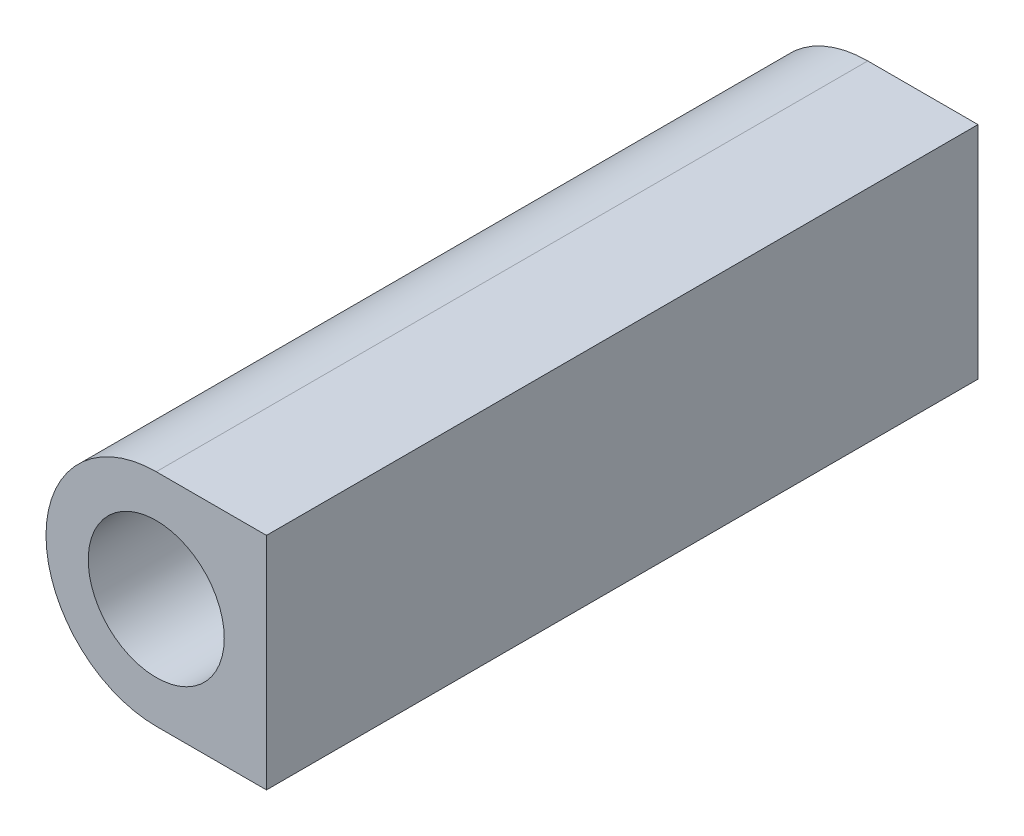
ISO-10303-21;
HEADER;
FILE_DESCRIPTION(('STEP AP214'),'2;1');
FILE_NAME('part.step','',(''),(''),'','','');
FILE_SCHEMA(('AUTOMOTIVE_DESIGN { 1 0 10303 214 1 1 1 1 }'));
ENDSEC;
DATA;
#1=APPLICATION_CONTEXT('core data for automotive mechanical design processes');
#2=APPLICATION_PROTOCOL_DEFINITION('international standard','automotive_design',2000,#1);
#3=PRODUCT_CONTEXT('',#1,'mechanical');
#4=PRODUCT('Part','Part','',(#3));
#5=PRODUCT_RELATED_PRODUCT_CATEGORY('part','',(#4));
#6=PRODUCT_DEFINITION_FORMATION('','',#4);
#7=PRODUCT_DEFINITION_CONTEXT('part definition',#1,'design');
#8=PRODUCT_DEFINITION('design','',#6,#7);
#9=PRODUCT_DEFINITION_SHAPE('','',#8);
#10=(LENGTH_UNIT() NAMED_UNIT(*) SI_UNIT(.MILLI.,.METRE.));
#11=(NAMED_UNIT(*) PLANE_ANGLE_UNIT() SI_UNIT($,.RADIAN.));
#12=(NAMED_UNIT(*) SI_UNIT($,.STERADIAN.) SOLID_ANGLE_UNIT());
#13=UNCERTAINTY_MEASURE_WITH_UNIT(LENGTH_MEASURE(1.E-05),#10,'distance_accuracy_value','');
#14=(GEOMETRIC_REPRESENTATION_CONTEXT(3) GLOBAL_UNCERTAINTY_ASSIGNED_CONTEXT((#13)) GLOBAL_UNIT_ASSIGNED_CONTEXT((#10,
#11,#12)) REPRESENTATION_CONTEXT('',''));
#15=CARTESIAN_POINT('',(0.,0.,0.));
#16=DIRECTION('',(0.,0.,1.));
#17=DIRECTION('',(1.,0.,0.));
#18=AXIS2_PLACEMENT_3D('',#15,#16,#17);
#19=CARTESIAN_POINT('',(12.5,12.5,80.6823752757681));
#20=DIRECTION('',(0.,-1.,0.));
#21=DIRECTION('',(0.,0.,-1.));
#22=AXIS2_PLACEMENT_3D('',#19,#20,#21);
#23=PLANE('',#22);
#24=DIRECTION('',(-1.,0.,0.));
#25=VECTOR('',#24,1.);
#26=CARTESIAN_POINT('',(12.5,12.5,0.));
#27=LINE('',#26,#25);
#28=CARTESIAN_POINT('',(12.5,12.5,0.));
#29=VERTEX_POINT('',#28);
#30=CARTESIAN_POINT('',(0.,12.5,0.));
#31=VERTEX_POINT('',#30);
#32=EDGE_CURVE('E115',#29,#31,#27,.T.);
#33=ORIENTED_EDGE('',*,*,#32,.T.);
#34=DIRECTION('',(0.,0.,-1.));
#35=VECTOR('',#34,1.);
#36=CARTESIAN_POINT('',(0.,12.5,80.6823752757681));
#37=LINE('',#36,#35);
#38=CARTESIAN_POINT('',(0.,12.5,80.6823752757681));
#39=VERTEX_POINT('',#38);
#40=EDGE_CURVE('E11',#39,#31,#37,.T.);
#41=ORIENTED_EDGE('',*,*,#40,.F.);
#42=DIRECTION('',(-1.,0.,0.));
#43=VECTOR('',#42,1.);
#44=CARTESIAN_POINT('',(12.5,12.5,80.6823752757681));
#45=LINE('',#44,#43);
#46=CARTESIAN_POINT('',(12.5,12.5,80.6823752757681));
#47=VERTEX_POINT('',#46);
#48=EDGE_CURVE('E98',#47,#39,#45,.T.);
#49=ORIENTED_EDGE('',*,*,#48,.F.);
#50=DIRECTION('',(0.,0.,-1.));
#51=VECTOR('',#50,1.);
#52=CARTESIAN_POINT('',(12.5,12.5,80.6823752757681));
#53=LINE('',#52,#51);
#54=EDGE_CURVE('E111',#47,#29,#53,.T.);
#55=ORIENTED_EDGE('',*,*,#54,.T.);
#56=EDGE_LOOP('',(#33,#41,#49,#55));
#57=FACE_BOUND('',#56,.T.);
#58=ADVANCED_FACE('F45',(#57),#23,.F.);
#59=CARTESIAN_POINT('',(0.,0.,80.6823752757681));
#60=DIRECTION('',(0.,0.,-1.));
#61=DIRECTION('',(-1.,0.,0.));
#62=AXIS2_PLACEMENT_3D('',#59,#60,#61);
#63=CYLINDRICAL_SURFACE('',#62,12.5);
#64=CARTESIAN_POINT('',(0.,0.,0.));
#65=DIRECTION('',(0.,0.,1.));
#66=DIRECTION('',(1.,0.,0.));
#67=AXIS2_PLACEMENT_3D('',#64,#65,#66);
#68=CIRCLE('',#67,12.5);
#69=CARTESIAN_POINT('',(0.,-12.5,0.));
#70=VERTEX_POINT('',#69);
#71=EDGE_CURVE('E103',#31,#70,#68,.T.);
#72=ORIENTED_EDGE('',*,*,#71,.T.);
#73=DIRECTION('',(0.,0.,-1.));
#74=VECTOR('',#73,1.);
#75=CARTESIAN_POINT('',(0.,-12.5,80.6823752757681));
#76=LINE('',#75,#74);
#77=CARTESIAN_POINT('',(0.,-12.5,80.6823752757681));
#78=VERTEX_POINT('',#77);
#79=EDGE_CURVE('E55',#78,#70,#76,.T.);
#80=ORIENTED_EDGE('',*,*,#79,.F.);
#81=CARTESIAN_POINT('',(0.,0.,80.6823752757681));
#82=DIRECTION('',(0.,0.,1.));
#83=DIRECTION('',(1.,0.,0.));
#84=AXIS2_PLACEMENT_3D('',#81,#82,#83);
#85=CIRCLE('',#84,12.5);
#86=EDGE_CURVE('E93',#39,#78,#85,.T.);
#87=ORIENTED_EDGE('',*,*,#86,.F.);
#88=ORIENTED_EDGE('',*,*,#40,.T.);
#89=EDGE_LOOP('',(#72,#80,#87,#88));
#90=FACE_BOUND('',#89,.T.);
#91=ADVANCED_FACE('F102',(#90),#63,.T.);
#92=CARTESIAN_POINT('',(0.,-12.5,80.6823752757681));
#93=DIRECTION('',(0.,1.,0.));
#94=DIRECTION('',(0.,0.,1.));
#95=AXIS2_PLACEMENT_3D('',#92,#93,#94);
#96=PLANE('',#95);
#97=DIRECTION('',(1.,0.,0.));
#98=VECTOR('',#97,1.);
#99=CARTESIAN_POINT('',(0.,-12.5,0.));
#100=LINE('',#99,#98);
#101=CARTESIAN_POINT('',(12.5,-12.5,0.));
#102=VERTEX_POINT('',#101);
#103=EDGE_CURVE('E80',#70,#102,#100,.T.);
#104=ORIENTED_EDGE('',*,*,#103,.T.);
#105=DIRECTION('',(0.,0.,-1.));
#106=VECTOR('',#105,1.);
#107=CARTESIAN_POINT('',(12.5,-12.5,80.6823752757681));
#108=LINE('',#107,#106);
#109=CARTESIAN_POINT('',(12.5,-12.5,80.6823752757681));
#110=VERTEX_POINT('',#109);
#111=EDGE_CURVE('E105',#110,#102,#108,.T.);
#112=ORIENTED_EDGE('',*,*,#111,.F.);
#113=DIRECTION('',(1.,0.,0.));
#114=VECTOR('',#113,1.);
#115=CARTESIAN_POINT('',(0.,-12.5,80.6823752757681));
#116=LINE('',#115,#114);
#117=EDGE_CURVE('E96',#78,#110,#116,.T.);
#118=ORIENTED_EDGE('',*,*,#117,.F.);
#119=ORIENTED_EDGE('',*,*,#79,.T.);
#120=EDGE_LOOP('',(#104,#112,#118,#119));
#121=FACE_BOUND('',#120,.T.);
#122=ADVANCED_FACE('F107',(#121),#96,.F.);
#123=CARTESIAN_POINT('',(12.5,-12.5,80.6823752757681));
#124=DIRECTION('',(-1.,0.,0.));
#125=DIRECTION('',(0.,0.,1.));
#126=AXIS2_PLACEMENT_3D('',#123,#124,#125);
#127=PLANE('',#126);
#128=DIRECTION('',(0.,1.,0.));
#129=VECTOR('',#128,1.);
#130=CARTESIAN_POINT('',(12.5,-12.5,0.));
#131=LINE('',#130,#129);
#132=EDGE_CURVE('E86',#102,#29,#131,.T.);
#133=ORIENTED_EDGE('',*,*,#132,.T.);
#134=ORIENTED_EDGE('',*,*,#54,.F.);
#135=DIRECTION('',(0.,1.,0.));
#136=VECTOR('',#135,1.);
#137=CARTESIAN_POINT('',(12.5,-12.5,80.6823752757681));
#138=LINE('',#137,#136);
#139=EDGE_CURVE('E63',#110,#47,#138,.T.);
#140=ORIENTED_EDGE('',*,*,#139,.F.);
#141=ORIENTED_EDGE('',*,*,#111,.T.);
#142=EDGE_LOOP('',(#133,#134,#140,#141));
#143=FACE_BOUND('',#142,.T.);
#144=ADVANCED_FACE('F129',(#143),#127,.F.);
#145=CARTESIAN_POINT('',(0.,0.,80.6823752757681));
#146=DIRECTION('',(0.,0.,1.));
#147=DIRECTION('',(1.,0.,0.));
#148=AXIS2_PLACEMENT_3D('',#145,#146,#147);
#149=PLANE('',#148);
#150=CARTESIAN_POINT('',(0.,0.,80.6823752757681));
#151=DIRECTION('',(0.,0.,1.));
#152=DIRECTION('',(1.,0.,0.));
#153=AXIS2_PLACEMENT_3D('',#150,#151,#152);
#154=CIRCLE('',#153,7.71309705810667);
#155=CARTESIAN_POINT('',(7.71309705810667,0.,80.6823752757681));
#156=VERTEX_POINT('',#155);
#157=EDGE_CURVE('E119',#156,#156,#154,.T.);
#158=ORIENTED_EDGE('',*,*,#157,.F.);
#159=EDGE_LOOP('',(#158));
#160=FACE_BOUND('',#159,.T.);
#161=ORIENTED_EDGE('',*,*,#48,.T.);
#162=ORIENTED_EDGE('',*,*,#86,.T.);
#163=ORIENTED_EDGE('',*,*,#117,.T.);
#164=ORIENTED_EDGE('',*,*,#139,.T.);
#165=EDGE_LOOP('',(#161,#162,#163,#164));
#166=FACE_BOUND('',#165,.T.);
#167=ADVANCED_FACE('F94',(#160,#166),#149,.T.);
#168=CARTESIAN_POINT('',(0.,0.,0.));
#169=DIRECTION('',(0.,0.,1.));
#170=DIRECTION('',(1.,0.,0.));
#171=AXIS2_PLACEMENT_3D('',#168,#169,#170);
#172=PLANE('',#171);
#173=CARTESIAN_POINT('',(0.,0.,0.));
#174=DIRECTION('',(0.,0.,-1.));
#175=DIRECTION('',(-1.,0.,0.));
#176=AXIS2_PLACEMENT_3D('',#173,#174,#175);
#177=CIRCLE('',#176,3.5);
#178=CARTESIAN_POINT('',(-3.5,0.,0.));
#179=VERTEX_POINT('',#178);
#180=EDGE_CURVE('E139',#179,#179,#177,.T.);
#181=ORIENTED_EDGE('',*,*,#180,.F.);
#182=EDGE_LOOP('',(#181));
#183=FACE_BOUND('',#182,.T.);
#184=ORIENTED_EDGE('',*,*,#32,.F.);
#185=ORIENTED_EDGE('',*,*,#132,.F.);
#186=ORIENTED_EDGE('',*,*,#103,.F.);
#187=ORIENTED_EDGE('',*,*,#71,.F.);
#188=EDGE_LOOP('',(#184,#185,#186,#187));
#189=FACE_BOUND('',#188,.T.);
#190=ADVANCED_FACE('F132',(#183,#189),#172,.F.);
#191=CARTESIAN_POINT('',(0.,0.,55.6823752757681));
#192=DIRECTION('',(0.,0.,1.));
#193=DIRECTION('',(1.,0.,0.));
#194=AXIS2_PLACEMENT_3D('',#191,#192,#193);
#195=CYLINDRICAL_SURFACE('',#194,7.71309705810667);
#196=ORIENTED_EDGE('',*,*,#157,.T.);
#197=EDGE_LOOP('',(#196));
#198=FACE_BOUND('',#197,.T.);
#199=CARTESIAN_POINT('',(0.,0.,5.68237527576813));
#200=DIRECTION('',(0.,0.,1.));
#201=DIRECTION('',(1.,0.,0.));
#202=AXIS2_PLACEMENT_3D('',#199,#200,#201);
#203=CIRCLE('',#202,7.71309705810667);
#204=CARTESIAN_POINT('',(7.71309705810667,0.,5.68237527576813));
#205=VERTEX_POINT('',#204);
#206=EDGE_CURVE('E143',#205,#205,#203,.T.);
#207=ORIENTED_EDGE('',*,*,#206,.F.);
#208=EDGE_LOOP('',(#207));
#209=FACE_BOUND('',#208,.T.);
#210=ADVANCED_FACE('F160',(#198,#209),#195,.F.);
#211=CARTESIAN_POINT('',(0.,0.,5.));
#212=DIRECTION('',(0.,0.,-1.));
#213=DIRECTION('',(-1.,0.,0.));
#214=AXIS2_PLACEMENT_3D('',#211,#212,#213);
#215=CYLINDRICAL_SURFACE('',#214,3.5);
#216=ORIENTED_EDGE('',*,*,#180,.T.);
#217=EDGE_LOOP('',(#216));
#218=FACE_BOUND('',#217,.T.);
#219=CARTESIAN_POINT('',(0.,0.,5.68237527576813));
#220=DIRECTION('',(0.,0.,1.));
#221=DIRECTION('',(1.,0.,0.));
#222=AXIS2_PLACEMENT_3D('',#219,#220,#221);
#223=CIRCLE('',#222,3.5);
#224=CARTESIAN_POINT('',(3.5,0.,5.68237527576813));
#225=VERTEX_POINT('',#224);
#226=EDGE_CURVE('E48',#225,#225,#223,.T.);
#227=ORIENTED_EDGE('',*,*,#226,.T.);
#228=EDGE_LOOP('',(#227));
#229=FACE_BOUND('',#228,.T.);
#230=ADVANCED_FACE('F152',(#218,#229),#215,.F.);
#231=CARTESIAN_POINT('',(0.,0.,5.68237527576813));
#232=DIRECTION('',(0.,0.,1.));
#233=DIRECTION('',(1.,0.,0.));
#234=AXIS2_PLACEMENT_3D('',#231,#232,#233);
#235=PLANE('',#234);
#236=ORIENTED_EDGE('',*,*,#226,.F.);
#237=EDGE_LOOP('',(#236));
#238=FACE_BOUND('',#237,.T.);
#239=ORIENTED_EDGE('',*,*,#206,.T.);
#240=EDGE_LOOP('',(#239));
#241=FACE_BOUND('',#240,.T.);
#242=ADVANCED_FACE('F154',(#238,#241),#235,.T.);
#243=CLOSED_SHELL('',(#58,#91,#122,#144,#167,#190,#210,#230,#242));
#244=MANIFOLD_SOLID_BREP('B2',#243);
#245=ADVANCED_BREP_SHAPE_REPRESENTATION('',(#18,#244),#14);
#246=SHAPE_DEFINITION_REPRESENTATION(#9,#245);
ENDSEC;
END-ISO-10303-21;
